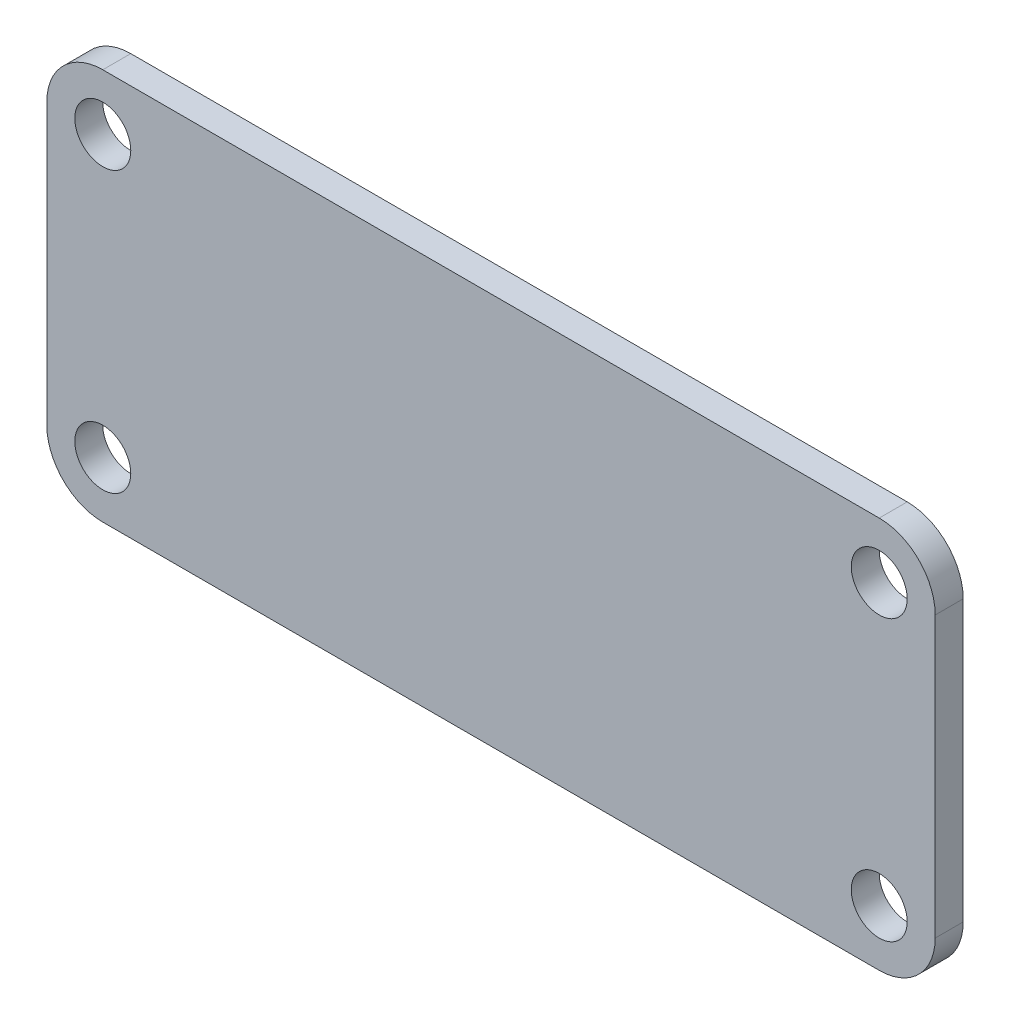
ISO-10303-21;
HEADER;
FILE_DESCRIPTION(('STEP AP214'),'2;1');
FILE_NAME('part.step','',(''),(''),'','','');
FILE_SCHEMA(('AUTOMOTIVE_DESIGN { 1 0 10303 214 1 1 1 1 }'));
ENDSEC;
DATA;
#1=APPLICATION_CONTEXT('core data for automotive mechanical design processes');
#2=APPLICATION_PROTOCOL_DEFINITION('international standard','automotive_design',2000,#1);
#3=PRODUCT_CONTEXT('',#1,'mechanical');
#4=PRODUCT('Part','Part','',(#3));
#5=PRODUCT_RELATED_PRODUCT_CATEGORY('part','',(#4));
#6=PRODUCT_DEFINITION_FORMATION('','',#4);
#7=PRODUCT_DEFINITION_CONTEXT('part definition',#1,'design');
#8=PRODUCT_DEFINITION('design','',#6,#7);
#9=PRODUCT_DEFINITION_SHAPE('','',#8);
#10=(LENGTH_UNIT() NAMED_UNIT(*) SI_UNIT(.MILLI.,.METRE.));
#11=(NAMED_UNIT(*) PLANE_ANGLE_UNIT() SI_UNIT($,.RADIAN.));
#12=(NAMED_UNIT(*) SI_UNIT($,.STERADIAN.) SOLID_ANGLE_UNIT());
#13=UNCERTAINTY_MEASURE_WITH_UNIT(LENGTH_MEASURE(1.E-05),#10,'distance_accuracy_value','');
#14=(GEOMETRIC_REPRESENTATION_CONTEXT(3) GLOBAL_UNCERTAINTY_ASSIGNED_CONTEXT((#13)) GLOBAL_UNIT_ASSIGNED_CONTEXT((#10,
#11,#12)) REPRESENTATION_CONTEXT('',''));
#15=CARTESIAN_POINT('',(0.,0.,0.));
#16=DIRECTION('',(0.,0.,1.));
#17=DIRECTION('',(1.,0.,0.));
#18=AXIS2_PLACEMENT_3D('',#15,#16,#17);
#19=CARTESIAN_POINT('',(138.745,50.,10.));
#20=DIRECTION('',(0.,0.,-1.));
#21=DIRECTION('',(-1.,0.,0.));
#22=AXIS2_PLACEMENT_3D('',#19,#20,#21);
#23=PLANE('',#22);
#24=CARTESIAN_POINT('',(138.745,50.,10.));
#25=DIRECTION('',(0.,0.,1.));
#26=DIRECTION('',(-1.,0.,0.));
#27=AXIS2_PLACEMENT_3D('',#24,#25,#26);
#28=CIRCLE('',#27,20.);
#29=CARTESIAN_POINT('',(158.745,50.,10.));
#30=VERTEX_POINT('',#29);
#31=CARTESIAN_POINT('',(138.745,70.,10.));
#32=VERTEX_POINT('',#31);
#33=EDGE_CURVE('E153',#30,#32,#28,.T.);
#34=ORIENTED_EDGE('',*,*,#33,.T.);
#35=DIRECTION('',(-1.,0.,0.));
#36=VECTOR('',#35,1.);
#37=CARTESIAN_POINT('',(-138.745,70.,10.));
#38=LINE('',#37,#36);
#39=CARTESIAN_POINT('',(-138.745,70.,10.));
#40=VERTEX_POINT('',#39);
#41=EDGE_CURVE('E101',#32,#40,#38,.T.);
#42=ORIENTED_EDGE('',*,*,#41,.T.);
#43=CARTESIAN_POINT('',(-138.745,50.,10.));
#44=DIRECTION('',(0.,0.,1.));
#45=DIRECTION('',(-1.,0.,0.));
#46=AXIS2_PLACEMENT_3D('',#43,#44,#45);
#47=CIRCLE('',#46,20.);
#48=CARTESIAN_POINT('',(-158.745,50.,10.));
#49=VERTEX_POINT('',#48);
#50=EDGE_CURVE('E168',#40,#49,#47,.T.);
#51=ORIENTED_EDGE('',*,*,#50,.T.);
#52=DIRECTION('',(0.,-1.,0.));
#53=VECTOR('',#52,1.);
#54=CARTESIAN_POINT('',(-158.745,50.,10.));
#55=LINE('',#54,#53);
#56=CARTESIAN_POINT('',(-158.745,-50.,10.));
#57=VERTEX_POINT('',#56);
#58=EDGE_CURVE('E181',#49,#57,#55,.T.);
#59=ORIENTED_EDGE('',*,*,#58,.T.);
#60=CARTESIAN_POINT('',(-138.745,-50.,10.));
#61=DIRECTION('',(0.,0.,1.));
#62=DIRECTION('',(1.,0.,0.));
#63=AXIS2_PLACEMENT_3D('',#60,#61,#62);
#64=CIRCLE('',#63,20.);
#65=CARTESIAN_POINT('',(-138.745,-70.,10.));
#66=VERTEX_POINT('',#65);
#67=EDGE_CURVE('E120',#57,#66,#64,.T.);
#68=ORIENTED_EDGE('',*,*,#67,.T.);
#69=DIRECTION('',(1.,0.,0.));
#70=VECTOR('',#69,1.);
#71=CARTESIAN_POINT('',(-138.745,-70.,10.));
#72=LINE('',#71,#70);
#73=CARTESIAN_POINT('',(138.745,-70.,10.));
#74=VERTEX_POINT('',#73);
#75=EDGE_CURVE('E114',#66,#74,#72,.T.);
#76=ORIENTED_EDGE('',*,*,#75,.T.);
#77=CARTESIAN_POINT('',(138.745,-50.,10.));
#78=DIRECTION('',(0.,0.,1.));
#79=DIRECTION('',(1.,0.,0.));
#80=AXIS2_PLACEMENT_3D('',#77,#78,#79);
#81=CIRCLE('',#80,20.);
#82=CARTESIAN_POINT('',(158.745,-50.,10.));
#83=VERTEX_POINT('',#82);
#84=EDGE_CURVE('E118',#74,#83,#81,.T.);
#85=ORIENTED_EDGE('',*,*,#84,.T.);
#86=DIRECTION('',(0.,1.,0.));
#87=VECTOR('',#86,1.);
#88=CARTESIAN_POINT('',(158.745,50.,10.));
#89=LINE('',#88,#87);
#90=EDGE_CURVE('E58',#83,#30,#89,.T.);
#91=ORIENTED_EDGE('',*,*,#90,.T.);
#92=EDGE_LOOP('',(#34,#42,#51,#59,#68,#76,#85,#91));
#93=FACE_BOUND('',#92,.T.);
#94=CARTESIAN_POINT('',(-138.745,50.,10.));
#95=DIRECTION('',(0.,0.,1.));
#96=DIRECTION('',(1.,0.,0.));
#97=AXIS2_PLACEMENT_3D('',#94,#95,#96);
#98=CIRCLE('',#97,10.);
#99=CARTESIAN_POINT('',(-128.745,50.,10.));
#100=VERTEX_POINT('',#99);
#101=EDGE_CURVE('E142',#100,#100,#98,.T.);
#102=ORIENTED_EDGE('',*,*,#101,.F.);
#103=EDGE_LOOP('',(#102));
#104=FACE_BOUND('',#103,.T.);
#105=CARTESIAN_POINT('',(-138.745,-50.,10.));
#106=DIRECTION('',(0.,0.,1.));
#107=DIRECTION('',(1.,0.,0.));
#108=AXIS2_PLACEMENT_3D('',#105,#106,#107);
#109=CIRCLE('',#108,10.);
#110=CARTESIAN_POINT('',(-128.745,-50.,10.));
#111=VERTEX_POINT('',#110);
#112=EDGE_CURVE('E190',#111,#111,#109,.T.);
#113=ORIENTED_EDGE('',*,*,#112,.F.);
#114=EDGE_LOOP('',(#113));
#115=FACE_BOUND('',#114,.T.);
#116=CARTESIAN_POINT('',(138.745,-50.,10.));
#117=DIRECTION('',(0.,0.,1.));
#118=DIRECTION('',(1.,0.,0.));
#119=AXIS2_PLACEMENT_3D('',#116,#117,#118);
#120=CIRCLE('',#119,10.);
#121=CARTESIAN_POINT('',(148.745,-50.,10.));
#122=VERTEX_POINT('',#121);
#123=EDGE_CURVE('E196',#122,#122,#120,.T.);
#124=ORIENTED_EDGE('',*,*,#123,.F.);
#125=EDGE_LOOP('',(#124));
#126=FACE_BOUND('',#125,.T.);
#127=CARTESIAN_POINT('',(138.745,50.,10.));
#128=DIRECTION('',(0.,0.,1.));
#129=DIRECTION('',(1.,0.,0.));
#130=AXIS2_PLACEMENT_3D('',#127,#128,#129);
#131=CIRCLE('',#130,10.);
#132=CARTESIAN_POINT('',(148.745,50.,10.));
#133=VERTEX_POINT('',#132);
#134=EDGE_CURVE('E202',#133,#133,#131,.T.);
#135=ORIENTED_EDGE('',*,*,#134,.F.);
#136=EDGE_LOOP('',(#135));
#137=FACE_BOUND('',#136,.T.);
#138=ADVANCED_FACE('F41',(#93,#104,#115,#126,#137),#23,.F.);
#139=CARTESIAN_POINT('',(138.745,50.,0.));
#140=DIRECTION('',(0.,0.,-1.));
#141=DIRECTION('',(-1.,0.,0.));
#142=AXIS2_PLACEMENT_3D('',#139,#140,#141);
#143=PLANE('',#142);
#144=CARTESIAN_POINT('',(138.745,-50.,0.));
#145=DIRECTION('',(0.,0.,1.));
#146=DIRECTION('',(1.,0.,0.));
#147=AXIS2_PLACEMENT_3D('',#144,#145,#146);
#148=CIRCLE('',#147,10.);
#149=CARTESIAN_POINT('',(148.745,-50.,0.));
#150=VERTEX_POINT('',#149);
#151=EDGE_CURVE('E199',#150,#150,#148,.T.);
#152=ORIENTED_EDGE('',*,*,#151,.T.);
#153=EDGE_LOOP('',(#152));
#154=FACE_BOUND('',#153,.T.);
#155=CARTESIAN_POINT('',(-138.745,50.,0.));
#156=DIRECTION('',(0.,0.,1.));
#157=DIRECTION('',(1.,0.,0.));
#158=AXIS2_PLACEMENT_3D('',#155,#156,#157);
#159=CIRCLE('',#158,10.);
#160=CARTESIAN_POINT('',(-128.745,50.,0.));
#161=VERTEX_POINT('',#160);
#162=EDGE_CURVE('E187',#161,#161,#159,.T.);
#163=ORIENTED_EDGE('',*,*,#162,.T.);
#164=EDGE_LOOP('',(#163));
#165=FACE_BOUND('',#164,.T.);
#166=CARTESIAN_POINT('',(138.745,50.,0.));
#167=DIRECTION('',(0.,0.,1.));
#168=DIRECTION('',(-1.,0.,0.));
#169=AXIS2_PLACEMENT_3D('',#166,#167,#168);
#170=CIRCLE('',#169,20.);
#171=CARTESIAN_POINT('',(158.745,50.,0.));
#172=VERTEX_POINT('',#171);
#173=CARTESIAN_POINT('',(138.745,70.,0.));
#174=VERTEX_POINT('',#173);
#175=EDGE_CURVE('E138',#172,#174,#170,.T.);
#176=ORIENTED_EDGE('',*,*,#175,.F.);
#177=DIRECTION('',(0.,1.,0.));
#178=VECTOR('',#177,1.);
#179=CARTESIAN_POINT('',(158.745,50.,0.));
#180=LINE('',#179,#178);
#181=CARTESIAN_POINT('',(158.745,-50.,0.));
#182=VERTEX_POINT('',#181);
#183=EDGE_CURVE('E93',#182,#172,#180,.T.);
#184=ORIENTED_EDGE('',*,*,#183,.F.);
#185=CARTESIAN_POINT('',(138.745,-50.,0.));
#186=DIRECTION('',(0.,0.,1.));
#187=DIRECTION('',(1.,0.,0.));
#188=AXIS2_PLACEMENT_3D('',#185,#186,#187);
#189=CIRCLE('',#188,20.);
#190=CARTESIAN_POINT('',(138.745,-70.,0.));
#191=VERTEX_POINT('',#190);
#192=EDGE_CURVE('E87',#191,#182,#189,.T.);
#193=ORIENTED_EDGE('',*,*,#192,.F.);
#194=DIRECTION('',(1.,0.,0.));
#195=VECTOR('',#194,1.);
#196=CARTESIAN_POINT('',(-138.745,-70.,0.));
#197=LINE('',#196,#195);
#198=CARTESIAN_POINT('',(-138.745,-70.,0.));
#199=VERTEX_POINT('',#198);
#200=EDGE_CURVE('E128',#199,#191,#197,.T.);
#201=ORIENTED_EDGE('',*,*,#200,.F.);
#202=CARTESIAN_POINT('',(-138.745,-50.,0.));
#203=DIRECTION('',(0.,0.,1.));
#204=DIRECTION('',(1.,0.,0.));
#205=AXIS2_PLACEMENT_3D('',#202,#203,#204);
#206=CIRCLE('',#205,20.);
#207=CARTESIAN_POINT('',(-158.745,-50.,0.));
#208=VERTEX_POINT('',#207);
#209=EDGE_CURVE('E148',#208,#199,#206,.T.);
#210=ORIENTED_EDGE('',*,*,#209,.F.);
#211=DIRECTION('',(0.,-1.,0.));
#212=VECTOR('',#211,1.);
#213=CARTESIAN_POINT('',(-158.745,50.,0.));
#214=LINE('',#213,#212);
#215=CARTESIAN_POINT('',(-158.745,50.,0.));
#216=VERTEX_POINT('',#215);
#217=EDGE_CURVE('E146',#216,#208,#214,.T.);
#218=ORIENTED_EDGE('',*,*,#217,.F.);
#219=CARTESIAN_POINT('',(-138.745,50.,0.));
#220=DIRECTION('',(0.,0.,1.));
#221=DIRECTION('',(-1.,0.,0.));
#222=AXIS2_PLACEMENT_3D('',#219,#220,#221);
#223=CIRCLE('',#222,20.);
#224=CARTESIAN_POINT('',(-138.745,70.,0.));
#225=VERTEX_POINT('',#224);
#226=EDGE_CURVE('E144',#225,#216,#223,.T.);
#227=ORIENTED_EDGE('',*,*,#226,.F.);
#228=DIRECTION('',(-1.,0.,0.));
#229=VECTOR('',#228,1.);
#230=CARTESIAN_POINT('',(-138.745,70.,0.));
#231=LINE('',#230,#229);
#232=EDGE_CURVE('E141',#174,#225,#231,.T.);
#233=ORIENTED_EDGE('',*,*,#232,.F.);
#234=EDGE_LOOP('',(#176,#184,#193,#201,#210,#218,#227,#233));
#235=FACE_BOUND('',#234,.T.);
#236=CARTESIAN_POINT('',(-138.745,-50.,0.));
#237=DIRECTION('',(0.,0.,1.));
#238=DIRECTION('',(1.,0.,0.));
#239=AXIS2_PLACEMENT_3D('',#236,#237,#238);
#240=CIRCLE('',#239,10.);
#241=CARTESIAN_POINT('',(-128.745,-50.,0.));
#242=VERTEX_POINT('',#241);
#243=EDGE_CURVE('E193',#242,#242,#240,.T.);
#244=ORIENTED_EDGE('',*,*,#243,.T.);
#245=EDGE_LOOP('',(#244));
#246=FACE_BOUND('',#245,.T.);
#247=CARTESIAN_POINT('',(138.745,50.,0.));
#248=DIRECTION('',(0.,0.,1.));
#249=DIRECTION('',(1.,0.,0.));
#250=AXIS2_PLACEMENT_3D('',#247,#248,#249);
#251=CIRCLE('',#250,10.);
#252=CARTESIAN_POINT('',(148.745,50.,0.));
#253=VERTEX_POINT('',#252);
#254=EDGE_CURVE('E205',#253,#253,#251,.T.);
#255=ORIENTED_EDGE('',*,*,#254,.T.);
#256=EDGE_LOOP('',(#255));
#257=FACE_BOUND('',#256,.T.);
#258=ADVANCED_FACE('F172',(#154,#165,#235,#246,#257),#143,.T.);
#259=CARTESIAN_POINT('',(138.745,50.,10.));
#260=DIRECTION('',(0.,0.,-1.));
#261=DIRECTION('',(-1.,0.,0.));
#262=AXIS2_PLACEMENT_3D('',#259,#260,#261);
#263=CYLINDRICAL_SURFACE('',#262,20.);
#264=ORIENTED_EDGE('',*,*,#175,.T.);
#265=DIRECTION('',(0.,0.,-1.));
#266=VECTOR('',#265,1.);
#267=CARTESIAN_POINT('',(138.745,70.,10.));
#268=LINE('',#267,#266);
#269=EDGE_CURVE('E11',#32,#174,#268,.T.);
#270=ORIENTED_EDGE('',*,*,#269,.F.);
#271=ORIENTED_EDGE('',*,*,#33,.F.);
#272=DIRECTION('',(0.,0.,-1.));
#273=VECTOR('',#272,1.);
#274=CARTESIAN_POINT('',(158.745,50.,10.));
#275=LINE('',#274,#273);
#276=EDGE_CURVE('E134',#30,#172,#275,.T.);
#277=ORIENTED_EDGE('',*,*,#276,.T.);
#278=EDGE_LOOP('',(#264,#270,#271,#277));
#279=FACE_BOUND('',#278,.T.);
#280=ADVANCED_FACE('F43',(#279),#263,.T.);
#281=CARTESIAN_POINT('',(-138.745,70.,10.));
#282=DIRECTION('',(0.,-1.,0.));
#283=DIRECTION('',(0.,0.,-1.));
#284=AXIS2_PLACEMENT_3D('',#281,#282,#283);
#285=PLANE('',#284);
#286=ORIENTED_EDGE('',*,*,#232,.T.);
#287=DIRECTION('',(0.,0.,-1.));
#288=VECTOR('',#287,1.);
#289=CARTESIAN_POINT('',(-138.745,70.,10.));
#290=LINE('',#289,#288);
#291=EDGE_CURVE('E50',#40,#225,#290,.T.);
#292=ORIENTED_EDGE('',*,*,#291,.F.);
#293=ORIENTED_EDGE('',*,*,#41,.F.);
#294=ORIENTED_EDGE('',*,*,#269,.T.);
#295=EDGE_LOOP('',(#286,#292,#293,#294));
#296=FACE_BOUND('',#295,.T.);
#297=ADVANCED_FACE('F237',(#296),#285,.F.);
#298=CARTESIAN_POINT('',(-138.745,50.,10.));
#299=DIRECTION('',(0.,0.,-1.));
#300=DIRECTION('',(-1.,0.,0.));
#301=AXIS2_PLACEMENT_3D('',#298,#299,#300);
#302=CYLINDRICAL_SURFACE('',#301,20.);
#303=ORIENTED_EDGE('',*,*,#226,.T.);
#304=DIRECTION('',(0.,0.,-1.));
#305=VECTOR('',#304,1.);
#306=CARTESIAN_POINT('',(-158.745,50.,10.));
#307=LINE('',#306,#305);
#308=EDGE_CURVE('E160',#49,#216,#307,.T.);
#309=ORIENTED_EDGE('',*,*,#308,.F.);
#310=ORIENTED_EDGE('',*,*,#50,.F.);
#311=ORIENTED_EDGE('',*,*,#291,.T.);
#312=EDGE_LOOP('',(#303,#309,#310,#311));
#313=FACE_BOUND('',#312,.T.);
#314=ADVANCED_FACE('F166',(#313),#302,.T.);
#315=CARTESIAN_POINT('',(-158.745,50.,10.));
#316=DIRECTION('',(1.,0.,0.));
#317=DIRECTION('',(0.,1.,0.));
#318=AXIS2_PLACEMENT_3D('',#315,#316,#317);
#319=PLANE('',#318);
#320=ORIENTED_EDGE('',*,*,#217,.T.);
#321=DIRECTION('',(0.,0.,-1.));
#322=VECTOR('',#321,1.);
#323=CARTESIAN_POINT('',(-158.745,-50.,10.));
#324=LINE('',#323,#322);
#325=EDGE_CURVE('E157',#57,#208,#324,.T.);
#326=ORIENTED_EDGE('',*,*,#325,.F.);
#327=ORIENTED_EDGE('',*,*,#58,.F.);
#328=ORIENTED_EDGE('',*,*,#308,.T.);
#329=EDGE_LOOP('',(#320,#326,#327,#328));
#330=FACE_BOUND('',#329,.T.);
#331=ADVANCED_FACE('F177',(#330),#319,.F.);
#332=CARTESIAN_POINT('',(-138.745,-50.,10.));
#333=DIRECTION('',(0.,0.,-1.));
#334=DIRECTION('',(-1.,0.,0.));
#335=AXIS2_PLACEMENT_3D('',#332,#333,#334);
#336=CYLINDRICAL_SURFACE('',#335,20.);
#337=ORIENTED_EDGE('',*,*,#209,.T.);
#338=DIRECTION('',(0.,0.,-1.));
#339=VECTOR('',#338,1.);
#340=CARTESIAN_POINT('',(-138.745,-70.,10.));
#341=LINE('',#340,#339);
#342=EDGE_CURVE('E129',#66,#199,#341,.T.);
#343=ORIENTED_EDGE('',*,*,#342,.F.);
#344=ORIENTED_EDGE('',*,*,#67,.F.);
#345=ORIENTED_EDGE('',*,*,#325,.T.);
#346=EDGE_LOOP('',(#337,#343,#344,#345));
#347=FACE_BOUND('',#346,.T.);
#348=ADVANCED_FACE('F180',(#347),#336,.T.);
#349=CARTESIAN_POINT('',(-138.745,-70.,10.));
#350=DIRECTION('',(0.,1.,0.));
#351=DIRECTION('',(0.,0.,1.));
#352=AXIS2_PLACEMENT_3D('',#349,#350,#351);
#353=PLANE('',#352);
#354=ORIENTED_EDGE('',*,*,#200,.T.);
#355=DIRECTION('',(0.,0.,-1.));
#356=VECTOR('',#355,1.);
#357=CARTESIAN_POINT('',(138.745,-70.,10.));
#358=LINE('',#357,#356);
#359=EDGE_CURVE('E125',#74,#191,#358,.T.);
#360=ORIENTED_EDGE('',*,*,#359,.F.);
#361=ORIENTED_EDGE('',*,*,#75,.F.);
#362=ORIENTED_EDGE('',*,*,#342,.T.);
#363=EDGE_LOOP('',(#354,#360,#361,#362));
#364=FACE_BOUND('',#363,.T.);
#365=ADVANCED_FACE('F126',(#364),#353,.F.);
#366=CARTESIAN_POINT('',(138.745,-50.,10.));
#367=DIRECTION('',(0.,0.,-1.));
#368=DIRECTION('',(-1.,0.,0.));
#369=AXIS2_PLACEMENT_3D('',#366,#367,#368);
#370=CYLINDRICAL_SURFACE('',#369,20.);
#371=ORIENTED_EDGE('',*,*,#192,.T.);
#372=DIRECTION('',(0.,0.,-1.));
#373=VECTOR('',#372,1.);
#374=CARTESIAN_POINT('',(158.745,-50.,10.));
#375=LINE('',#374,#373);
#376=EDGE_CURVE('E130',#83,#182,#375,.T.);
#377=ORIENTED_EDGE('',*,*,#376,.F.);
#378=ORIENTED_EDGE('',*,*,#84,.F.);
#379=ORIENTED_EDGE('',*,*,#359,.T.);
#380=EDGE_LOOP('',(#371,#377,#378,#379));
#381=FACE_BOUND('',#380,.T.);
#382=ADVANCED_FACE('F132',(#381),#370,.T.);
#383=CARTESIAN_POINT('',(158.745,50.,10.));
#384=DIRECTION('',(-1.,0.,0.));
#385=DIRECTION('',(0.,0.,1.));
#386=AXIS2_PLACEMENT_3D('',#383,#384,#385);
#387=PLANE('',#386);
#388=ORIENTED_EDGE('',*,*,#183,.T.);
#389=ORIENTED_EDGE('',*,*,#276,.F.);
#390=ORIENTED_EDGE('',*,*,#90,.F.);
#391=ORIENTED_EDGE('',*,*,#376,.T.);
#392=EDGE_LOOP('',(#388,#389,#390,#391));
#393=FACE_BOUND('',#392,.T.);
#394=ADVANCED_FACE('F225',(#393),#387,.F.);
#395=CARTESIAN_POINT('',(-138.745,50.,10.));
#396=DIRECTION('',(0.,0.,-1.));
#397=DIRECTION('',(-1.,0.,0.));
#398=AXIS2_PLACEMENT_3D('',#395,#396,#397);
#399=CYLINDRICAL_SURFACE('',#398,10.);
#400=ORIENTED_EDGE('',*,*,#101,.T.);
#401=EDGE_LOOP('',(#400));
#402=FACE_BOUND('',#401,.T.);
#403=ORIENTED_EDGE('',*,*,#162,.F.);
#404=EDGE_LOOP('',(#403));
#405=FACE_BOUND('',#404,.T.);
#406=ADVANCED_FACE('F222',(#402,#405),#399,.F.);
#407=CARTESIAN_POINT('',(-138.745,-50.,10.));
#408=DIRECTION('',(0.,0.,-1.));
#409=DIRECTION('',(-1.,0.,0.));
#410=AXIS2_PLACEMENT_3D('',#407,#408,#409);
#411=CYLINDRICAL_SURFACE('',#410,10.);
#412=ORIENTED_EDGE('',*,*,#112,.T.);
#413=EDGE_LOOP('',(#412));
#414=FACE_BOUND('',#413,.T.);
#415=ORIENTED_EDGE('',*,*,#243,.F.);
#416=EDGE_LOOP('',(#415));
#417=FACE_BOUND('',#416,.T.);
#418=ADVANCED_FACE('F313',(#414,#417),#411,.F.);
#419=CARTESIAN_POINT('',(138.745,-50.,10.));
#420=DIRECTION('',(0.,0.,-1.));
#421=DIRECTION('',(-1.,0.,0.));
#422=AXIS2_PLACEMENT_3D('',#419,#420,#421);
#423=CYLINDRICAL_SURFACE('',#422,10.);
#424=ORIENTED_EDGE('',*,*,#123,.T.);
#425=EDGE_LOOP('',(#424));
#426=FACE_BOUND('',#425,.T.);
#427=ORIENTED_EDGE('',*,*,#151,.F.);
#428=EDGE_LOOP('',(#427));
#429=FACE_BOUND('',#428,.T.);
#430=ADVANCED_FACE('F322',(#426,#429),#423,.F.);
#431=CARTESIAN_POINT('',(138.745,50.,10.));
#432=DIRECTION('',(0.,0.,-1.));
#433=DIRECTION('',(-1.,0.,0.));
#434=AXIS2_PLACEMENT_3D('',#431,#432,#433);
#435=CYLINDRICAL_SURFACE('',#434,10.);
#436=ORIENTED_EDGE('',*,*,#134,.T.);
#437=EDGE_LOOP('',(#436));
#438=FACE_BOUND('',#437,.T.);
#439=ORIENTED_EDGE('',*,*,#254,.F.);
#440=EDGE_LOOP('',(#439));
#441=FACE_BOUND('',#440,.T.);
#442=ADVANCED_FACE('F211',(#438,#441),#435,.F.);
#443=CLOSED_SHELL('',(#138,#258,#280,#297,#314,#331,#348,#365,#382,#394,#406,#418,#430,#442));
#444=MANIFOLD_SOLID_BREP('B2',#443);
#445=ADVANCED_BREP_SHAPE_REPRESENTATION('',(#18,#444),#14);
#446=SHAPE_DEFINITION_REPRESENTATION(#9,#445);
ENDSEC;
END-ISO-10303-21;
